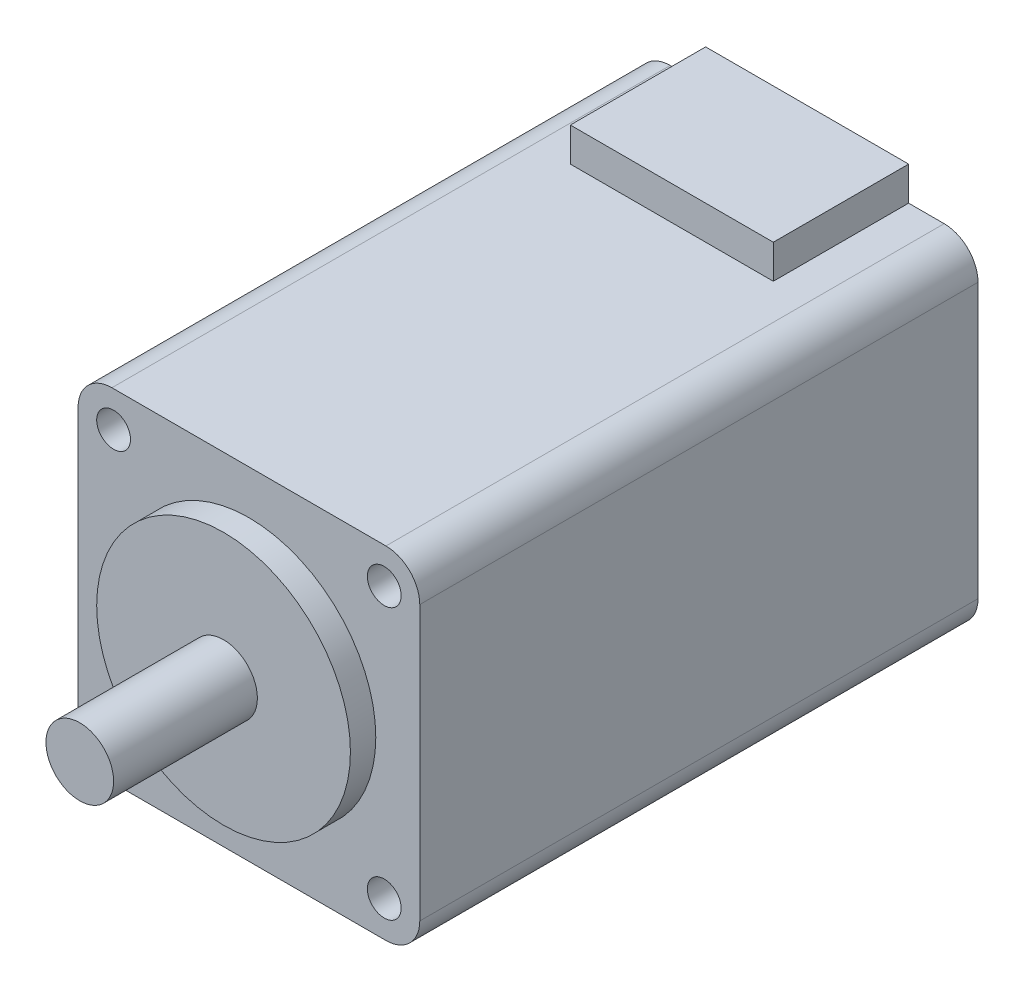
ISO-10303-21;
HEADER;
FILE_DESCRIPTION(('STEP AP214'),'2;1');
FILE_NAME('part.step','',(''),(''),'','','');
FILE_SCHEMA(('AUTOMOTIVE_DESIGN { 1 0 10303 214 1 1 1 1 }'));
ENDSEC;
DATA;
#1=APPLICATION_CONTEXT('core data for automotive mechanical design processes');
#2=APPLICATION_PROTOCOL_DEFINITION('international standard','automotive_design',2000,#1);
#3=PRODUCT_CONTEXT('',#1,'mechanical');
#4=PRODUCT('Part','Part','',(#3));
#5=PRODUCT_RELATED_PRODUCT_CATEGORY('part','',(#4));
#6=PRODUCT_DEFINITION_FORMATION('','',#4);
#7=PRODUCT_DEFINITION_CONTEXT('part definition',#1,'design');
#8=PRODUCT_DEFINITION('design','',#6,#7);
#9=PRODUCT_DEFINITION_SHAPE('','',#8);
#10=(LENGTH_UNIT() NAMED_UNIT(*) SI_UNIT(.MILLI.,.METRE.));
#11=(NAMED_UNIT(*) PLANE_ANGLE_UNIT() SI_UNIT($,.RADIAN.));
#12=(NAMED_UNIT(*) SI_UNIT($,.STERADIAN.) SOLID_ANGLE_UNIT());
#13=UNCERTAINTY_MEASURE_WITH_UNIT(LENGTH_MEASURE(1.E-05),#10,'distance_accuracy_value','');
#14=(GEOMETRIC_REPRESENTATION_CONTEXT(3) GLOBAL_UNCERTAINTY_ASSIGNED_CONTEXT((#13)) GLOBAL_UNIT_ASSIGNED_CONTEXT((#10,
#11,#12)) REPRESENTATION_CONTEXT('',''));
#15=CARTESIAN_POINT('',(0.,0.,0.));
#16=DIRECTION('',(0.,0.,1.));
#17=DIRECTION('',(1.,0.,0.));
#18=AXIS2_PLACEMENT_3D('',#15,#16,#17);
#19=CARTESIAN_POINT('',(-8.1,8.1,-33.));
#20=DIRECTION('',(0.,0.,1.));
#21=DIRECTION('',(1.,0.,0.));
#22=AXIS2_PLACEMENT_3D('',#19,#20,#21);
#23=CYLINDRICAL_SURFACE('',#22,2.);
#24=CARTESIAN_POINT('',(-8.1,8.1,0.));
#25=DIRECTION('',(0.,0.,1.));
#26=DIRECTION('',(-1.,0.,0.));
#27=AXIS2_PLACEMENT_3D('',#24,#25,#26);
#28=CIRCLE('',#27,2.);
#29=CARTESIAN_POINT('',(-8.09999999999999,10.1,0.));
#30=VERTEX_POINT('',#29);
#31=CARTESIAN_POINT('',(-10.1,8.09999999999999,0.));
#32=VERTEX_POINT('',#31);
#33=EDGE_CURVE('E185',#30,#32,#28,.T.);
#34=ORIENTED_EDGE('',*,*,#33,.F.);
#35=DIRECTION('',(0.,0.,1.));
#36=VECTOR('',#35,1.);
#37=CARTESIAN_POINT('',(-8.09999999999999,10.1,-33.));
#38=LINE('',#37,#36);
#39=CARTESIAN_POINT('',(-8.09999999999999,10.1,-33.));
#40=VERTEX_POINT('',#39);
#41=EDGE_CURVE('E236',#40,#30,#38,.T.);
#42=ORIENTED_EDGE('',*,*,#41,.F.);
#43=CARTESIAN_POINT('',(-8.1,8.1,-33.));
#44=DIRECTION('',(0.,0.,1.));
#45=DIRECTION('',(-1.,0.,0.));
#46=AXIS2_PLACEMENT_3D('',#43,#44,#45);
#47=CIRCLE('',#46,2.);
#48=CARTESIAN_POINT('',(-10.1,8.09999999999999,-33.));
#49=VERTEX_POINT('',#48);
#50=EDGE_CURVE('E188',#40,#49,#47,.T.);
#51=ORIENTED_EDGE('',*,*,#50,.T.);
#52=DIRECTION('',(0.,0.,1.));
#53=VECTOR('',#52,1.);
#54=CARTESIAN_POINT('',(-10.1,8.09999999999999,-33.));
#55=LINE('',#54,#53);
#56=EDGE_CURVE('E213',#49,#32,#55,.T.);
#57=ORIENTED_EDGE('',*,*,#56,.T.);
#58=EDGE_LOOP('',(#34,#42,#51,#57));
#59=FACE_BOUND('',#58,.T.);
#60=ADVANCED_FACE('F38',(#59),#23,.T.);
#61=CARTESIAN_POINT('',(-8.09999999999999,10.1,-33.));
#62=DIRECTION('',(0.,1.,0.));
#63=DIRECTION('',(0.,0.,1.));
#64=AXIS2_PLACEMENT_3D('',#61,#62,#63);
#65=PLANE('',#64);
#66=DIRECTION('',(0.,0.,-1.));
#67=VECTOR('',#66,1.);
#68=CARTESIAN_POINT('',(-6.,10.1,-25.));
#69=LINE('',#68,#67);
#70=CARTESIAN_POINT('',(-6.,10.1,-25.));
#71=VERTEX_POINT('',#70);
#72=CARTESIAN_POINT('',(-6.,10.1,-33.));
#73=VERTEX_POINT('',#72);
#74=EDGE_CURVE('E147',#71,#73,#69,.T.);
#75=ORIENTED_EDGE('',*,*,#74,.T.);
#76=DIRECTION('',(-1.,0.,0.));
#77=VECTOR('',#76,1.);
#78=CARTESIAN_POINT('',(-8.09999999999999,10.1,-33.));
#79=LINE('',#78,#77);
#80=EDGE_CURVE('E210',#73,#40,#79,.T.);
#81=ORIENTED_EDGE('',*,*,#80,.T.);
#82=ORIENTED_EDGE('',*,*,#41,.T.);
#83=DIRECTION('',(-1.,0.,0.));
#84=VECTOR('',#83,1.);
#85=CARTESIAN_POINT('',(-8.09999999999999,10.1,0.));
#86=LINE('',#85,#84);
#87=CARTESIAN_POINT('',(8.09999999999999,10.1,0.));
#88=VERTEX_POINT('',#87);
#89=EDGE_CURVE('E192',#88,#30,#86,.T.);
#90=ORIENTED_EDGE('',*,*,#89,.F.);
#91=DIRECTION('',(0.,0.,1.));
#92=VECTOR('',#91,1.);
#93=CARTESIAN_POINT('',(8.09999999999999,10.1,-33.));
#94=LINE('',#93,#92);
#95=CARTESIAN_POINT('',(8.09999999999999,10.1,-33.));
#96=VERTEX_POINT('',#95);
#97=EDGE_CURVE('E238',#96,#88,#94,.T.);
#98=ORIENTED_EDGE('',*,*,#97,.F.);
#99=CARTESIAN_POINT('',(6.,10.1,-33.));
#100=VERTEX_POINT('',#99);
#101=EDGE_CURVE('E211',#96,#100,#79,.T.);
#102=ORIENTED_EDGE('',*,*,#101,.T.);
#103=DIRECTION('',(0.,0.,-1.));
#104=VECTOR('',#103,1.);
#105=CARTESIAN_POINT('',(6.,10.1,-25.));
#106=LINE('',#105,#104);
#107=CARTESIAN_POINT('',(6.,10.1,-25.));
#108=VERTEX_POINT('',#107);
#109=EDGE_CURVE('E53',#108,#100,#106,.T.);
#110=ORIENTED_EDGE('',*,*,#109,.F.);
#111=DIRECTION('',(-1.,0.,0.));
#112=VECTOR('',#111,1.);
#113=CARTESIAN_POINT('',(6.,10.1,-25.));
#114=LINE('',#113,#112);
#115=EDGE_CURVE('E58',#108,#71,#114,.T.);
#116=ORIENTED_EDGE('',*,*,#115,.T.);
#117=EDGE_LOOP('',(#75,#81,#82,#90,#98,#102,#110,#116));
#118=FACE_BOUND('',#117,.T.);
#119=ADVANCED_FACE('F262',(#118),#65,.T.);
#120=CARTESIAN_POINT('',(8.1,8.1,-33.));
#121=DIRECTION('',(0.,0.,1.));
#122=DIRECTION('',(1.,0.,0.));
#123=AXIS2_PLACEMENT_3D('',#120,#121,#122);
#124=CYLINDRICAL_SURFACE('',#123,2.);
#125=CARTESIAN_POINT('',(8.1,8.1,0.));
#126=DIRECTION('',(0.,0.,1.));
#127=DIRECTION('',(-1.,0.,0.));
#128=AXIS2_PLACEMENT_3D('',#125,#126,#127);
#129=CIRCLE('',#128,2.);
#130=CARTESIAN_POINT('',(10.1,8.09999999999999,0.));
#131=VERTEX_POINT('',#130);
#132=EDGE_CURVE('E231',#131,#88,#129,.T.);
#133=ORIENTED_EDGE('',*,*,#132,.F.);
#134=DIRECTION('',(0.,0.,1.));
#135=VECTOR('',#134,1.);
#136=CARTESIAN_POINT('',(10.1,8.09999999999999,-33.));
#137=LINE('',#136,#135);
#138=CARTESIAN_POINT('',(10.1,8.09999999999999,-33.));
#139=VERTEX_POINT('',#138);
#140=EDGE_CURVE('E240',#139,#131,#137,.T.);
#141=ORIENTED_EDGE('',*,*,#140,.F.);
#142=CARTESIAN_POINT('',(8.1,8.1,-33.));
#143=DIRECTION('',(0.,0.,1.));
#144=DIRECTION('',(-1.,0.,0.));
#145=AXIS2_PLACEMENT_3D('',#142,#143,#144);
#146=CIRCLE('',#145,2.);
#147=EDGE_CURVE('E207',#139,#96,#146,.T.);
#148=ORIENTED_EDGE('',*,*,#147,.T.);
#149=ORIENTED_EDGE('',*,*,#97,.T.);
#150=EDGE_LOOP('',(#133,#141,#148,#149));
#151=FACE_BOUND('',#150,.T.);
#152=ADVANCED_FACE('F282',(#151),#124,.T.);
#153=CARTESIAN_POINT('',(10.1,-8.09999999999998,-33.));
#154=DIRECTION('',(1.,0.,0.));
#155=DIRECTION('',(0.,0.,-1.));
#156=AXIS2_PLACEMENT_3D('',#153,#154,#155);
#157=PLANE('',#156);
#158=DIRECTION('',(0.,1.,0.));
#159=VECTOR('',#158,1.);
#160=CARTESIAN_POINT('',(10.1,-8.09999999999998,0.));
#161=LINE('',#160,#159);
#162=CARTESIAN_POINT('',(10.1,-8.1,0.));
#163=VERTEX_POINT('',#162);
#164=EDGE_CURVE('E228',#163,#131,#161,.T.);
#165=ORIENTED_EDGE('',*,*,#164,.F.);
#166=DIRECTION('',(0.,0.,1.));
#167=VECTOR('',#166,1.);
#168=CARTESIAN_POINT('',(10.1,-8.1,-33.));
#169=LINE('',#168,#167);
#170=CARTESIAN_POINT('',(10.1,-8.1,-33.));
#171=VERTEX_POINT('',#170);
#172=EDGE_CURVE('E242',#171,#163,#169,.T.);
#173=ORIENTED_EDGE('',*,*,#172,.F.);
#174=DIRECTION('',(0.,1.,0.));
#175=VECTOR('',#174,1.);
#176=CARTESIAN_POINT('',(10.1,-8.09999999999998,-33.));
#177=LINE('',#176,#175);
#178=EDGE_CURVE('E204',#171,#139,#177,.T.);
#179=ORIENTED_EDGE('',*,*,#178,.T.);
#180=ORIENTED_EDGE('',*,*,#140,.T.);
#181=EDGE_LOOP('',(#165,#173,#179,#180));
#182=FACE_BOUND('',#181,.T.);
#183=ADVANCED_FACE('F279',(#182),#157,.T.);
#184=CARTESIAN_POINT('',(8.1,-8.1,-33.));
#185=DIRECTION('',(0.,0.,1.));
#186=DIRECTION('',(1.,0.,0.));
#187=AXIS2_PLACEMENT_3D('',#184,#185,#186);
#188=CYLINDRICAL_SURFACE('',#187,2.);
#189=CARTESIAN_POINT('',(8.1,-8.1,0.));
#190=DIRECTION('',(0.,0.,1.));
#191=DIRECTION('',(1.,0.,0.));
#192=AXIS2_PLACEMENT_3D('',#189,#190,#191);
#193=CIRCLE('',#192,2.);
#194=CARTESIAN_POINT('',(8.09999999999999,-10.1,0.));
#195=VERTEX_POINT('',#194);
#196=EDGE_CURVE('E225',#195,#163,#193,.T.);
#197=ORIENTED_EDGE('',*,*,#196,.F.);
#198=DIRECTION('',(0.,0.,1.));
#199=VECTOR('',#198,1.);
#200=CARTESIAN_POINT('',(8.09999999999999,-10.1,-33.));
#201=LINE('',#200,#199);
#202=CARTESIAN_POINT('',(8.09999999999999,-10.1,-33.));
#203=VERTEX_POINT('',#202);
#204=EDGE_CURVE('E244',#203,#195,#201,.T.);
#205=ORIENTED_EDGE('',*,*,#204,.F.);
#206=CARTESIAN_POINT('',(8.1,-8.1,-33.));
#207=DIRECTION('',(0.,0.,1.));
#208=DIRECTION('',(1.,0.,0.));
#209=AXIS2_PLACEMENT_3D('',#206,#207,#208);
#210=CIRCLE('',#209,2.);
#211=EDGE_CURVE('E201',#203,#171,#210,.T.);
#212=ORIENTED_EDGE('',*,*,#211,.T.);
#213=ORIENTED_EDGE('',*,*,#172,.T.);
#214=EDGE_LOOP('',(#197,#205,#212,#213));
#215=FACE_BOUND('',#214,.T.);
#216=ADVANCED_FACE('F275',(#215),#188,.T.);
#217=CARTESIAN_POINT('',(-8.09999999999999,-10.1,-33.));
#218=DIRECTION('',(0.,-1.,0.));
#219=DIRECTION('',(0.,0.,-1.));
#220=AXIS2_PLACEMENT_3D('',#217,#218,#219);
#221=PLANE('',#220);
#222=DIRECTION('',(1.,0.,0.));
#223=VECTOR('',#222,1.);
#224=CARTESIAN_POINT('',(-8.09999999999999,-10.1,0.));
#225=LINE('',#224,#223);
#226=CARTESIAN_POINT('',(-8.09999999999999,-10.1,0.));
#227=VERTEX_POINT('',#226);
#228=EDGE_CURVE('E222',#227,#195,#225,.T.);
#229=ORIENTED_EDGE('',*,*,#228,.F.);
#230=DIRECTION('',(0.,0.,1.));
#231=VECTOR('',#230,1.);
#232=CARTESIAN_POINT('',(-8.09999999999999,-10.1,-33.));
#233=LINE('',#232,#231);
#234=CARTESIAN_POINT('',(-8.09999999999999,-10.1,-33.));
#235=VERTEX_POINT('',#234);
#236=EDGE_CURVE('E246',#235,#227,#233,.T.);
#237=ORIENTED_EDGE('',*,*,#236,.F.);
#238=DIRECTION('',(1.,0.,0.));
#239=VECTOR('',#238,1.);
#240=CARTESIAN_POINT('',(-8.09999999999999,-10.1,-33.));
#241=LINE('',#240,#239);
#242=EDGE_CURVE('E198',#235,#203,#241,.T.);
#243=ORIENTED_EDGE('',*,*,#242,.T.);
#244=ORIENTED_EDGE('',*,*,#204,.T.);
#245=EDGE_LOOP('',(#229,#237,#243,#244));
#246=FACE_BOUND('',#245,.T.);
#247=ADVANCED_FACE('F273',(#246),#221,.T.);
#248=CARTESIAN_POINT('',(-8.1,-8.1,-33.));
#249=DIRECTION('',(0.,0.,1.));
#250=DIRECTION('',(1.,0.,0.));
#251=AXIS2_PLACEMENT_3D('',#248,#249,#250);
#252=CYLINDRICAL_SURFACE('',#251,2.);
#253=CARTESIAN_POINT('',(-8.1,-8.1,0.));
#254=DIRECTION('',(0.,0.,1.));
#255=DIRECTION('',(-1.,0.,0.));
#256=AXIS2_PLACEMENT_3D('',#253,#254,#255);
#257=CIRCLE('',#256,2.);
#258=CARTESIAN_POINT('',(-10.1,-8.09999999999998,0.));
#259=VERTEX_POINT('',#258);
#260=EDGE_CURVE('E219',#259,#227,#257,.T.);
#261=ORIENTED_EDGE('',*,*,#260,.F.);
#262=DIRECTION('',(0.,0.,1.));
#263=VECTOR('',#262,1.);
#264=CARTESIAN_POINT('',(-10.1,-8.09999999999998,-33.));
#265=LINE('',#264,#263);
#266=CARTESIAN_POINT('',(-10.1,-8.09999999999998,-33.));
#267=VERTEX_POINT('',#266);
#268=EDGE_CURVE('E248',#267,#259,#265,.T.);
#269=ORIENTED_EDGE('',*,*,#268,.F.);
#270=CARTESIAN_POINT('',(-8.1,-8.1,-33.));
#271=DIRECTION('',(0.,0.,1.));
#272=DIRECTION('',(-1.,0.,0.));
#273=AXIS2_PLACEMENT_3D('',#270,#271,#272);
#274=CIRCLE('',#273,2.);
#275=EDGE_CURVE('E195',#267,#235,#274,.T.);
#276=ORIENTED_EDGE('',*,*,#275,.T.);
#277=ORIENTED_EDGE('',*,*,#236,.T.);
#278=EDGE_LOOP('',(#261,#269,#276,#277));
#279=FACE_BOUND('',#278,.T.);
#280=ADVANCED_FACE('F269',(#279),#252,.T.);
#281=CARTESIAN_POINT('',(-10.1,-8.09999999999998,-33.));
#282=DIRECTION('',(-1.,0.,0.));
#283=DIRECTION('',(0.,0.,1.));
#284=AXIS2_PLACEMENT_3D('',#281,#282,#283);
#285=PLANE('',#284);
#286=DIRECTION('',(0.,-1.,0.));
#287=VECTOR('',#286,1.);
#288=CARTESIAN_POINT('',(-10.1,-8.09999999999998,0.));
#289=LINE('',#288,#287);
#290=EDGE_CURVE('E216',#32,#259,#289,.T.);
#291=ORIENTED_EDGE('',*,*,#290,.F.);
#292=ORIENTED_EDGE('',*,*,#56,.F.);
#293=DIRECTION('',(0.,-1.,0.));
#294=VECTOR('',#293,1.);
#295=CARTESIAN_POINT('',(-10.1,-8.09999999999998,-33.));
#296=LINE('',#295,#294);
#297=EDGE_CURVE('E191',#49,#267,#296,.T.);
#298=ORIENTED_EDGE('',*,*,#297,.T.);
#299=ORIENTED_EDGE('',*,*,#268,.T.);
#300=EDGE_LOOP('',(#291,#292,#298,#299));
#301=FACE_BOUND('',#300,.T.);
#302=ADVANCED_FACE('F256',(#301),#285,.T.);
#303=CARTESIAN_POINT('',(-8.1,8.1,-33.));
#304=DIRECTION('',(0.,0.,-1.));
#305=DIRECTION('',(-1.,0.,0.));
#306=AXIS2_PLACEMENT_3D('',#303,#304,#305);
#307=PLANE('',#306);
#308=ORIENTED_EDGE('',*,*,#50,.F.);
#309=ORIENTED_EDGE('',*,*,#80,.F.);
#310=DIRECTION('',(0.,1.,0.));
#311=VECTOR('',#310,1.);
#312=CARTESIAN_POINT('',(-6.,10.1,-33.));
#313=LINE('',#312,#311);
#314=CARTESIAN_POINT('',(-6.,12.1,-33.));
#315=VERTEX_POINT('',#314);
#316=EDGE_CURVE('E157',#73,#315,#313,.T.);
#317=ORIENTED_EDGE('',*,*,#316,.T.);
#318=DIRECTION('',(1.,0.,0.));
#319=VECTOR('',#318,1.);
#320=CARTESIAN_POINT('',(6.,12.1,-33.));
#321=LINE('',#320,#319);
#322=CARTESIAN_POINT('',(6.,12.1,-33.));
#323=VERTEX_POINT('',#322);
#324=EDGE_CURVE('E132',#315,#323,#321,.T.);
#325=ORIENTED_EDGE('',*,*,#324,.T.);
#326=DIRECTION('',(0.,-1.,0.));
#327=VECTOR('',#326,1.);
#328=CARTESIAN_POINT('',(6.,10.1,-33.));
#329=LINE('',#328,#327);
#330=EDGE_CURVE('E148',#323,#100,#329,.T.);
#331=ORIENTED_EDGE('',*,*,#330,.T.);
#332=ORIENTED_EDGE('',*,*,#101,.F.);
#333=ORIENTED_EDGE('',*,*,#147,.F.);
#334=ORIENTED_EDGE('',*,*,#178,.F.);
#335=ORIENTED_EDGE('',*,*,#211,.F.);
#336=ORIENTED_EDGE('',*,*,#242,.F.);
#337=ORIENTED_EDGE('',*,*,#275,.F.);
#338=ORIENTED_EDGE('',*,*,#297,.F.);
#339=EDGE_LOOP('',(#308,#309,#317,#325,#331,#332,#333,#334,#335,#336,#337,#338));
#340=FACE_BOUND('',#339,.T.);
#341=ADVANCED_FACE('F264',(#340),#307,.T.);
#342=CARTESIAN_POINT('',(-8.1,8.1,0.));
#343=DIRECTION('',(0.,0.,-1.));
#344=DIRECTION('',(-1.,0.,0.));
#345=AXIS2_PLACEMENT_3D('',#342,#343,#344);
#346=PLANE('',#345);
#347=CARTESIAN_POINT('',(0.,0.,0.));
#348=DIRECTION('',(0.,0.,-1.));
#349=DIRECTION('',(-1.,0.,0.));
#350=AXIS2_PLACEMENT_3D('',#347,#348,#349);
#351=CIRCLE('',#350,7.5);
#352=CARTESIAN_POINT('',(-7.5,0.,0.));
#353=VERTEX_POINT('',#352);
#354=EDGE_CURVE('E41',#353,#353,#351,.F.);
#355=ORIENTED_EDGE('',*,*,#354,.F.);
#356=EDGE_LOOP('',(#355));
#357=FACE_BOUND('',#356,.T.);
#358=CARTESIAN_POINT('',(-7.99999999999983,-8.,0.));
#359=DIRECTION('',(0.,0.,1.));
#360=DIRECTION('',(1.,0.,0.));
#361=AXIS2_PLACEMENT_3D('',#358,#359,#360);
#362=CIRCLE('',#361,0.999999999999999);
#363=CARTESIAN_POINT('',(-6.99999999999983,-8.,0.));
#364=VERTEX_POINT('',#363);
#365=EDGE_CURVE('E161',#364,#364,#362,.T.);
#366=ORIENTED_EDGE('',*,*,#365,.F.);
#367=EDGE_LOOP('',(#366));
#368=FACE_BOUND('',#367,.T.);
#369=CARTESIAN_POINT('',(8.00000000000017,-8.,0.));
#370=DIRECTION('',(0.,0.,1.));
#371=DIRECTION('',(1.,0.,0.));
#372=AXIS2_PLACEMENT_3D('',#369,#370,#371);
#373=CIRCLE('',#372,1.);
#374=CARTESIAN_POINT('',(9.00000000000017,-8.,0.));
#375=VERTEX_POINT('',#374);
#376=EDGE_CURVE('E174',#375,#375,#373,.T.);
#377=ORIENTED_EDGE('',*,*,#376,.F.);
#378=EDGE_LOOP('',(#377));
#379=FACE_BOUND('',#378,.T.);
#380=CARTESIAN_POINT('',(8.,8.,0.));
#381=DIRECTION('',(0.,0.,1.));
#382=DIRECTION('',(1.,0.,0.));
#383=AXIS2_PLACEMENT_3D('',#380,#381,#382);
#384=CIRCLE('',#383,1.);
#385=CARTESIAN_POINT('',(9.,8.,0.));
#386=VERTEX_POINT('',#385);
#387=EDGE_CURVE('E168',#386,#386,#384,.T.);
#388=ORIENTED_EDGE('',*,*,#387,.F.);
#389=EDGE_LOOP('',(#388));
#390=FACE_BOUND('',#389,.T.);
#391=CARTESIAN_POINT('',(-8.,8.,0.));
#392=DIRECTION('',(0.,0.,1.));
#393=DIRECTION('',(1.,0.,0.));
#394=AXIS2_PLACEMENT_3D('',#391,#392,#393);
#395=CIRCLE('',#394,1.);
#396=CARTESIAN_POINT('',(-7.,8.,0.));
#397=VERTEX_POINT('',#396);
#398=EDGE_CURVE('E167',#397,#397,#395,.T.);
#399=ORIENTED_EDGE('',*,*,#398,.F.);
#400=EDGE_LOOP('',(#399));
#401=FACE_BOUND('',#400,.T.);
#402=ORIENTED_EDGE('',*,*,#33,.T.);
#403=ORIENTED_EDGE('',*,*,#290,.T.);
#404=ORIENTED_EDGE('',*,*,#260,.T.);
#405=ORIENTED_EDGE('',*,*,#228,.T.);
#406=ORIENTED_EDGE('',*,*,#196,.T.);
#407=ORIENTED_EDGE('',*,*,#164,.T.);
#408=ORIENTED_EDGE('',*,*,#132,.T.);
#409=ORIENTED_EDGE('',*,*,#89,.T.);
#410=EDGE_LOOP('',(#402,#403,#404,#405,#406,#407,#408,#409));
#411=FACE_BOUND('',#410,.T.);
#412=ADVANCED_FACE('F259',(#357,#368,#379,#390,#401,#411),#346,.F.);
#413=CARTESIAN_POINT('',(-8.,8.,-3.5));
#414=DIRECTION('',(0.,0.,1.));
#415=DIRECTION('',(1.,0.,0.));
#416=AXIS2_PLACEMENT_3D('',#413,#414,#415);
#417=CYLINDRICAL_SURFACE('',#416,1.);
#418=CARTESIAN_POINT('',(-8.,8.,-3.5));
#419=DIRECTION('',(0.,0.,1.));
#420=DIRECTION('',(1.,0.,0.));
#421=AXIS2_PLACEMENT_3D('',#418,#419,#420);
#422=CIRCLE('',#421,1.);
#423=CARTESIAN_POINT('',(-7.,8.,-3.5));
#424=VERTEX_POINT('',#423);
#425=EDGE_CURVE('E182',#424,#424,#422,.T.);
#426=ORIENTED_EDGE('',*,*,#425,.F.);
#427=EDGE_LOOP('',(#426));
#428=FACE_BOUND('',#427,.T.);
#429=ORIENTED_EDGE('',*,*,#398,.T.);
#430=EDGE_LOOP('',(#429));
#431=FACE_BOUND('',#430,.T.);
#432=ADVANCED_FACE('F318',(#428,#431),#417,.F.);
#433=CARTESIAN_POINT('',(-8.,8.,-3.5));
#434=DIRECTION('',(0.,0.,1.));
#435=DIRECTION('',(1.,0.,0.));
#436=AXIS2_PLACEMENT_3D('',#433,#434,#435);
#437=PLANE('',#436);
#438=ORIENTED_EDGE('',*,*,#425,.T.);
#439=EDGE_LOOP('',(#438));
#440=FACE_BOUND('',#439,.T.);
#441=ADVANCED_FACE('F323',(#440),#437,.T.);
#442=CARTESIAN_POINT('',(8.,8.,-3.5));
#443=DIRECTION('',(0.,0.,1.));
#444=DIRECTION('',(1.,0.,0.));
#445=AXIS2_PLACEMENT_3D('',#442,#443,#444);
#446=CYLINDRICAL_SURFACE('',#445,1.);
#447=CARTESIAN_POINT('',(8.,8.,-3.5));
#448=DIRECTION('',(0.,0.,1.));
#449=DIRECTION('',(1.,0.,0.));
#450=AXIS2_PLACEMENT_3D('',#447,#448,#449);
#451=CIRCLE('',#450,1.);
#452=CARTESIAN_POINT('',(9.,8.,-3.5));
#453=VERTEX_POINT('',#452);
#454=EDGE_CURVE('E164',#453,#453,#451,.T.);
#455=ORIENTED_EDGE('',*,*,#454,.F.);
#456=EDGE_LOOP('',(#455));
#457=FACE_BOUND('',#456,.T.);
#458=ORIENTED_EDGE('',*,*,#387,.T.);
#459=EDGE_LOOP('',(#458));
#460=FACE_BOUND('',#459,.T.);
#461=ADVANCED_FACE('F327',(#457,#460),#446,.F.);
#462=CARTESIAN_POINT('',(8.,8.,-3.5));
#463=DIRECTION('',(0.,0.,1.));
#464=DIRECTION('',(1.,0.,0.));
#465=AXIS2_PLACEMENT_3D('',#462,#463,#464);
#466=PLANE('',#465);
#467=ORIENTED_EDGE('',*,*,#454,.T.);
#468=EDGE_LOOP('',(#467));
#469=FACE_BOUND('',#468,.T.);
#470=ADVANCED_FACE('F340',(#469),#466,.T.);
#471=CARTESIAN_POINT('',(8.00000000000017,-8.,-3.5));
#472=DIRECTION('',(0.,0.,1.));
#473=DIRECTION('',(1.,0.,0.));
#474=AXIS2_PLACEMENT_3D('',#471,#472,#473);
#475=CYLINDRICAL_SURFACE('',#474,1.);
#476=CARTESIAN_POINT('',(8.00000000000017,-8.,-3.5));
#477=DIRECTION('',(0.,0.,1.));
#478=DIRECTION('',(1.,0.,0.));
#479=AXIS2_PLACEMENT_3D('',#476,#477,#478);
#480=CIRCLE('',#479,1.);
#481=CARTESIAN_POINT('',(9.00000000000017,-8.,-3.5));
#482=VERTEX_POINT('',#481);
#483=EDGE_CURVE('E171',#482,#482,#480,.T.);
#484=ORIENTED_EDGE('',*,*,#483,.F.);
#485=EDGE_LOOP('',(#484));
#486=FACE_BOUND('',#485,.T.);
#487=ORIENTED_EDGE('',*,*,#376,.T.);
#488=EDGE_LOOP('',(#487));
#489=FACE_BOUND('',#488,.T.);
#490=ADVANCED_FACE('F337',(#486,#489),#475,.F.);
#491=CARTESIAN_POINT('',(8.00000000000017,-8.,-3.5));
#492=DIRECTION('',(0.,0.,1.));
#493=DIRECTION('',(1.,0.,0.));
#494=AXIS2_PLACEMENT_3D('',#491,#492,#493);
#495=PLANE('',#494);
#496=ORIENTED_EDGE('',*,*,#483,.T.);
#497=EDGE_LOOP('',(#496));
#498=FACE_BOUND('',#497,.T.);
#499=ADVANCED_FACE('F332',(#498),#495,.T.);
#500=CARTESIAN_POINT('',(-7.99999999999983,-8.,-3.5));
#501=DIRECTION('',(0.,0.,1.));
#502=DIRECTION('',(1.,0.,0.));
#503=AXIS2_PLACEMENT_3D('',#500,#501,#502);
#504=CYLINDRICAL_SURFACE('',#503,0.999999999999999);
#505=CARTESIAN_POINT('',(-7.99999999999983,-8.,-3.5));
#506=DIRECTION('',(0.,0.,1.));
#507=DIRECTION('',(1.,0.,0.));
#508=AXIS2_PLACEMENT_3D('',#505,#506,#507);
#509=CIRCLE('',#508,0.999999999999999);
#510=CARTESIAN_POINT('',(-6.99999999999983,-8.,-3.5));
#511=VERTEX_POINT('',#510);
#512=EDGE_CURVE('E177',#511,#511,#509,.T.);
#513=ORIENTED_EDGE('',*,*,#512,.F.);
#514=EDGE_LOOP('',(#513));
#515=FACE_BOUND('',#514,.T.);
#516=ORIENTED_EDGE('',*,*,#365,.T.);
#517=EDGE_LOOP('',(#516));
#518=FACE_BOUND('',#517,.T.);
#519=ADVANCED_FACE('F329',(#515,#518),#504,.F.);
#520=CARTESIAN_POINT('',(-7.99999999999983,-8.,-3.5));
#521=DIRECTION('',(0.,0.,1.));
#522=DIRECTION('',(1.,0.,0.));
#523=AXIS2_PLACEMENT_3D('',#520,#521,#522);
#524=PLANE('',#523);
#525=ORIENTED_EDGE('',*,*,#512,.T.);
#526=EDGE_LOOP('',(#525));
#527=FACE_BOUND('',#526,.T.);
#528=ADVANCED_FACE('F293',(#527),#524,.T.);
#529=CARTESIAN_POINT('',(-6.,10.1,-25.));
#530=DIRECTION('',(-1.,0.,0.));
#531=DIRECTION('',(0.,0.,1.));
#532=AXIS2_PLACEMENT_3D('',#529,#530,#531);
#533=PLANE('',#532);
#534=ORIENTED_EDGE('',*,*,#316,.F.);
#535=ORIENTED_EDGE('',*,*,#74,.F.);
#536=DIRECTION('',(0.,1.,0.));
#537=VECTOR('',#536,1.);
#538=CARTESIAN_POINT('',(-6.,10.1,-25.));
#539=LINE('',#538,#537);
#540=CARTESIAN_POINT('',(-6.,12.1,-25.));
#541=VERTEX_POINT('',#540);
#542=EDGE_CURVE('E143',#71,#541,#539,.T.);
#543=ORIENTED_EDGE('',*,*,#542,.T.);
#544=DIRECTION('',(0.,0.,-1.));
#545=VECTOR('',#544,1.);
#546=CARTESIAN_POINT('',(-6.,12.1,-25.));
#547=LINE('',#546,#545);
#548=EDGE_CURVE('E127',#541,#315,#547,.T.);
#549=ORIENTED_EDGE('',*,*,#548,.T.);
#550=EDGE_LOOP('',(#534,#535,#543,#549));
#551=FACE_BOUND('',#550,.T.);
#552=ADVANCED_FACE('F146',(#551),#533,.T.);
#553=CARTESIAN_POINT('',(6.,10.1,-25.));
#554=DIRECTION('',(1.,0.,0.));
#555=DIRECTION('',(0.,0.,-1.));
#556=AXIS2_PLACEMENT_3D('',#553,#554,#555);
#557=PLANE('',#556);
#558=ORIENTED_EDGE('',*,*,#330,.F.);
#559=DIRECTION('',(0.,0.,-1.));
#560=VECTOR('',#559,1.);
#561=CARTESIAN_POINT('',(6.,12.1,-25.));
#562=LINE('',#561,#560);
#563=CARTESIAN_POINT('',(6.,12.1,-25.));
#564=VERTEX_POINT('',#563);
#565=EDGE_CURVE('E137',#564,#323,#562,.T.);
#566=ORIENTED_EDGE('',*,*,#565,.F.);
#567=DIRECTION('',(0.,-1.,0.));
#568=VECTOR('',#567,1.);
#569=CARTESIAN_POINT('',(6.,10.1,-25.));
#570=LINE('',#569,#568);
#571=EDGE_CURVE('E144',#564,#108,#570,.T.);
#572=ORIENTED_EDGE('',*,*,#571,.T.);
#573=ORIENTED_EDGE('',*,*,#109,.T.);
#574=EDGE_LOOP('',(#558,#566,#572,#573));
#575=FACE_BOUND('',#574,.T.);
#576=ADVANCED_FACE('F286',(#575),#557,.T.);
#577=CARTESIAN_POINT('',(6.,12.1,-25.));
#578=DIRECTION('',(0.,1.,0.));
#579=DIRECTION('',(0.,0.,1.));
#580=AXIS2_PLACEMENT_3D('',#577,#578,#579);
#581=PLANE('',#580);
#582=ORIENTED_EDGE('',*,*,#324,.F.);
#583=ORIENTED_EDGE('',*,*,#548,.F.);
#584=DIRECTION('',(1.,0.,0.));
#585=VECTOR('',#584,1.);
#586=CARTESIAN_POINT('',(6.,12.1,-25.));
#587=LINE('',#586,#585);
#588=EDGE_CURVE('E130',#541,#564,#587,.T.);
#589=ORIENTED_EDGE('',*,*,#588,.T.);
#590=ORIENTED_EDGE('',*,*,#565,.T.);
#591=EDGE_LOOP('',(#582,#583,#589,#590));
#592=FACE_BOUND('',#591,.T.);
#593=ADVANCED_FACE('F129',(#592),#581,.T.);
#594=CARTESIAN_POINT('',(0.,0.,-25.));
#595=DIRECTION('',(0.,0.,1.));
#596=DIRECTION('',(1.,0.,0.));
#597=AXIS2_PLACEMENT_3D('',#594,#595,#596);
#598=PLANE('',#597);
#599=ORIENTED_EDGE('',*,*,#542,.F.);
#600=ORIENTED_EDGE('',*,*,#115,.F.);
#601=ORIENTED_EDGE('',*,*,#571,.F.);
#602=ORIENTED_EDGE('',*,*,#588,.F.);
#603=EDGE_LOOP('',(#599,#600,#601,#602));
#604=FACE_BOUND('',#603,.T.);
#605=ADVANCED_FACE('F142',(#604),#598,.T.);
#606=CARTESIAN_POINT('',(0.,0.,1.5));
#607=DIRECTION('',(0.,0.,-1.));
#608=DIRECTION('',(-1.,0.,0.));
#609=AXIS2_PLACEMENT_3D('',#606,#607,#608);
#610=CYLINDRICAL_SURFACE('',#609,7.5);
#611=CARTESIAN_POINT('',(0.,0.,1.5));
#612=DIRECTION('',(0.,0.,1.));
#613=DIRECTION('',(1.,0.,0.));
#614=AXIS2_PLACEMENT_3D('',#611,#612,#613);
#615=CIRCLE('',#614,7.5);
#616=CARTESIAN_POINT('',(7.5,0.,1.5));
#617=VERTEX_POINT('',#616);
#618=EDGE_CURVE('E153',#617,#617,#615,.T.);
#619=ORIENTED_EDGE('',*,*,#618,.F.);
#620=EDGE_LOOP('',(#619));
#621=FACE_BOUND('',#620,.T.);
#622=ORIENTED_EDGE('',*,*,#354,.T.);
#623=EDGE_LOOP('',(#622));
#624=FACE_BOUND('',#623,.T.);
#625=ADVANCED_FACE('F393',(#621,#624),#610,.T.);
#626=CARTESIAN_POINT('',(0.,0.,1.5));
#627=DIRECTION('',(0.,0.,1.));
#628=DIRECTION('',(1.,0.,0.));
#629=AXIS2_PLACEMENT_3D('',#626,#627,#628);
#630=PLANE('',#629);
#631=CARTESIAN_POINT('',(0.,0.,1.5));
#632=DIRECTION('',(0.,0.,1.));
#633=DIRECTION('',(1.,0.,0.));
#634=AXIS2_PLACEMENT_3D('',#631,#632,#633);
#635=CIRCLE('',#634,2.);
#636=CARTESIAN_POINT('',(2.,0.,1.5));
#637=VERTEX_POINT('',#636);
#638=EDGE_CURVE('E11',#637,#637,#635,.T.);
#639=ORIENTED_EDGE('',*,*,#638,.F.);
#640=EDGE_LOOP('',(#639));
#641=FACE_BOUND('',#640,.T.);
#642=ORIENTED_EDGE('',*,*,#618,.T.);
#643=EDGE_LOOP('',(#642));
#644=FACE_BOUND('',#643,.T.);
#645=ADVANCED_FACE('F401',(#641,#644),#630,.T.);
#646=CARTESIAN_POINT('',(0.,0.,10.));
#647=DIRECTION('',(0.,0.,-1.));
#648=DIRECTION('',(-1.,0.,0.));
#649=AXIS2_PLACEMENT_3D('',#646,#647,#648);
#650=CYLINDRICAL_SURFACE('',#649,2.);
#651=CARTESIAN_POINT('',(0.,0.,10.));
#652=DIRECTION('',(0.,0.,1.));
#653=DIRECTION('',(1.,0.,0.));
#654=AXIS2_PLACEMENT_3D('',#651,#652,#653);
#655=CIRCLE('',#654,2.);
#656=CARTESIAN_POINT('',(2.,0.,10.));
#657=VERTEX_POINT('',#656);
#658=EDGE_CURVE('E556',#657,#657,#655,.T.);
#659=ORIENTED_EDGE('',*,*,#658,.F.);
#660=EDGE_LOOP('',(#659));
#661=FACE_BOUND('',#660,.T.);
#662=ORIENTED_EDGE('',*,*,#638,.T.);
#663=EDGE_LOOP('',(#662));
#664=FACE_BOUND('',#663,.T.);
#665=ADVANCED_FACE('F410',(#661,#664),#650,.T.);
#666=CARTESIAN_POINT('',(0.,0.,10.));
#667=DIRECTION('',(0.,0.,1.));
#668=DIRECTION('',(1.,0.,0.));
#669=AXIS2_PLACEMENT_3D('',#666,#667,#668);
#670=PLANE('',#669);
#671=ORIENTED_EDGE('',*,*,#658,.T.);
#672=EDGE_LOOP('',(#671));
#673=FACE_BOUND('',#672,.T.);
#674=ADVANCED_FACE('F419',(#673),#670,.T.);
#675=CLOSED_SHELL('',(#60,#119,#152,#183,#216,#247,#280,#302,#341,#412,#432,#441,#461,#470,#490,
#499,#519,#528,#552,#576,#593,#605,#625,#645,#665,#674));
#676=MANIFOLD_SOLID_BREP('B2',#675);
#677=ADVANCED_BREP_SHAPE_REPRESENTATION('',(#18,#676),#14);
#678=SHAPE_DEFINITION_REPRESENTATION(#9,#677);
ENDSEC;
END-ISO-10303-21;
